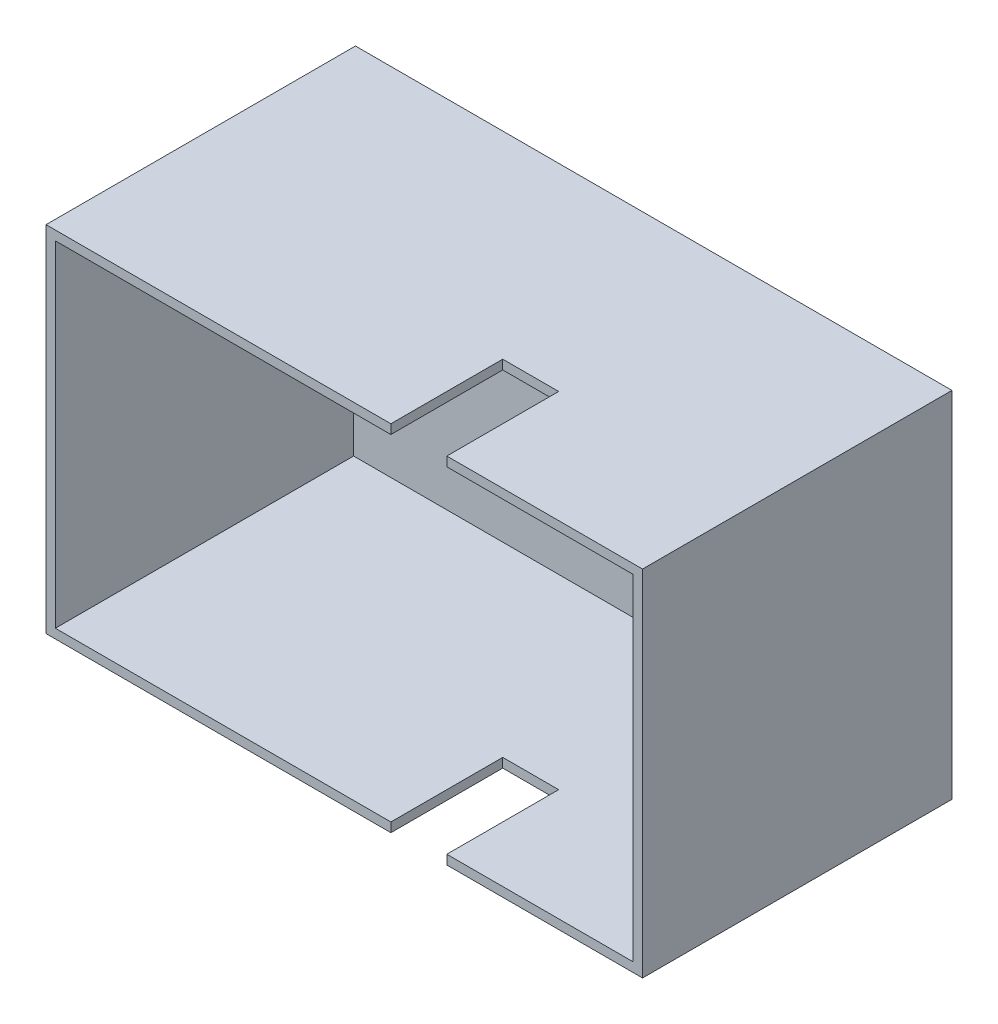
ISO-10303-21;
HEADER;
FILE_DESCRIPTION(('STEP AP214'),'2;1');
FILE_NAME('part.step','',(''),(''),'','','');
FILE_SCHEMA(('AUTOMOTIVE_DESIGN { 1 0 10303 214 1 1 1 1 }'));
ENDSEC;
DATA;
#1=APPLICATION_CONTEXT('core data for automotive mechanical design processes');
#2=APPLICATION_PROTOCOL_DEFINITION('international standard','automotive_design',2000,#1);
#3=PRODUCT_CONTEXT('',#1,'mechanical');
#4=PRODUCT('Part','Part','',(#3));
#5=PRODUCT_RELATED_PRODUCT_CATEGORY('part','',(#4));
#6=PRODUCT_DEFINITION_FORMATION('','',#4);
#7=PRODUCT_DEFINITION_CONTEXT('part definition',#1,'design');
#8=PRODUCT_DEFINITION('design','',#6,#7);
#9=PRODUCT_DEFINITION_SHAPE('','',#8);
#10=(LENGTH_UNIT() NAMED_UNIT(*) SI_UNIT(.MILLI.,.METRE.));
#11=(NAMED_UNIT(*) PLANE_ANGLE_UNIT() SI_UNIT($,.RADIAN.));
#12=(NAMED_UNIT(*) SI_UNIT($,.STERADIAN.) SOLID_ANGLE_UNIT());
#13=UNCERTAINTY_MEASURE_WITH_UNIT(LENGTH_MEASURE(1.E-05),#10,'distance_accuracy_value','');
#14=(GEOMETRIC_REPRESENTATION_CONTEXT(3) GLOBAL_UNCERTAINTY_ASSIGNED_CONTEXT((#13)) GLOBAL_UNIT_ASSIGNED_CONTEXT((#10,
#11,#12)) REPRESENTATION_CONTEXT('',''));
#15=CARTESIAN_POINT('',(0.,0.,0.));
#16=DIRECTION('',(0.,0.,1.));
#17=DIRECTION('',(1.,0.,0.));
#18=AXIS2_PLACEMENT_3D('',#15,#16,#17);
#19=CARTESIAN_POINT('',(0.,0.,80.));
#20=DIRECTION('',(0.,0.,1.));
#21=DIRECTION('',(1.,0.,0.));
#22=AXIS2_PLACEMENT_3D('',#19,#20,#21);
#23=PLANE('',#22);
#24=DIRECTION('',(0.,-1.,0.));
#25=VECTOR('',#24,1.);
#26=CARTESIAN_POINT('',(27.5,47.5,80.));
#27=LINE('',#26,#25);
#28=CARTESIAN_POINT('',(27.5,-45.,80.));
#29=VERTEX_POINT('',#28);
#30=CARTESIAN_POINT('',(27.5,-47.5,80.));
#31=VERTEX_POINT('',#30);
#32=EDGE_CURVE('E287',#29,#31,#27,.T.);
#33=ORIENTED_EDGE('',*,*,#32,.T.);
#34=DIRECTION('',(1.,0.,0.));
#35=VECTOR('',#34,1.);
#36=CARTESIAN_POINT('',(-80.,-47.5,80.));
#37=LINE('',#36,#35);
#38=CARTESIAN_POINT('',(80.,-47.5,80.));
#39=VERTEX_POINT('',#38);
#40=EDGE_CURVE('E279',#31,#39,#37,.T.);
#41=ORIENTED_EDGE('',*,*,#40,.T.);
#42=DIRECTION('',(0.,1.,0.));
#43=VECTOR('',#42,1.);
#44=CARTESIAN_POINT('',(80.,47.5,80.));
#45=LINE('',#44,#43);
#46=CARTESIAN_POINT('',(80.,47.5,80.));
#47=VERTEX_POINT('',#46);
#48=EDGE_CURVE('E172',#39,#47,#45,.T.);
#49=ORIENTED_EDGE('',*,*,#48,.T.);
#50=DIRECTION('',(-1.,0.,0.));
#51=VECTOR('',#50,1.);
#52=CARTESIAN_POINT('',(-80.,47.5,80.));
#53=LINE('',#52,#51);
#54=CARTESIAN_POINT('',(27.5,47.5,80.));
#55=VERTEX_POINT('',#54);
#56=EDGE_CURVE('E171',#47,#55,#53,.T.);
#57=ORIENTED_EDGE('',*,*,#56,.T.);
#58=CARTESIAN_POINT('',(27.5,45.,80.));
#59=VERTEX_POINT('',#58);
#60=EDGE_CURVE('E224',#55,#59,#27,.T.);
#61=ORIENTED_EDGE('',*,*,#60,.T.);
#62=DIRECTION('',(-1.,0.,0.));
#63=VECTOR('',#62,1.);
#64=CARTESIAN_POINT('',(-77.5,45.,80.));
#65=LINE('',#64,#63);
#66=CARTESIAN_POINT('',(77.5,45.,80.));
#67=VERTEX_POINT('',#66);
#68=EDGE_CURVE('E251',#67,#59,#65,.T.);
#69=ORIENTED_EDGE('',*,*,#68,.F.);
#70=DIRECTION('',(0.,1.,0.));
#71=VECTOR('',#70,1.);
#72=CARTESIAN_POINT('',(77.5,45.,80.));
#73=LINE('',#72,#71);
#74=CARTESIAN_POINT('',(77.5,-45.,80.));
#75=VERTEX_POINT('',#74);
#76=EDGE_CURVE('E248',#75,#67,#73,.T.);
#77=ORIENTED_EDGE('',*,*,#76,.F.);
#78=DIRECTION('',(1.,0.,0.));
#79=VECTOR('',#78,1.);
#80=CARTESIAN_POINT('',(-77.5,-45.,80.));
#81=LINE('',#80,#79);
#82=EDGE_CURVE('E257',#29,#75,#81,.T.);
#83=ORIENTED_EDGE('',*,*,#82,.F.);
#84=EDGE_LOOP('',(#33,#41,#49,#57,#61,#69,#77,#83));
#85=FACE_BOUND('',#84,.T.);
#86=ADVANCED_FACE('F36',(#85),#23,.T.);
#87=DIRECTION('',(0.,-1.,0.));
#88=VECTOR('',#87,1.);
#89=CARTESIAN_POINT('',(12.5,47.5,80.));
#90=LINE('',#89,#88);
#91=CARTESIAN_POINT('',(12.5,47.5,80.));
#92=VERTEX_POINT('',#91);
#93=CARTESIAN_POINT('',(12.5,45.,80.));
#94=VERTEX_POINT('',#93);
#95=EDGE_CURVE('E51',#92,#94,#90,.T.);
#96=ORIENTED_EDGE('',*,*,#95,.F.);
#97=CARTESIAN_POINT('',(-80.,47.5,80.));
#98=VERTEX_POINT('',#97);
#99=EDGE_CURVE('E161',#92,#98,#53,.T.);
#100=ORIENTED_EDGE('',*,*,#99,.T.);
#101=DIRECTION('',(0.,-1.,0.));
#102=VECTOR('',#101,1.);
#103=CARTESIAN_POINT('',(-80.,47.5,80.));
#104=LINE('',#103,#102);
#105=CARTESIAN_POINT('',(-80.,-47.5,80.));
#106=VERTEX_POINT('',#105);
#107=EDGE_CURVE('E278',#98,#106,#104,.T.);
#108=ORIENTED_EDGE('',*,*,#107,.T.);
#109=CARTESIAN_POINT('',(12.5,-47.5,80.));
#110=VERTEX_POINT('',#109);
#111=EDGE_CURVE('E175',#106,#110,#37,.T.);
#112=ORIENTED_EDGE('',*,*,#111,.T.);
#113=CARTESIAN_POINT('',(12.5,-45.,80.));
#114=VERTEX_POINT('',#113);
#115=EDGE_CURVE('E165',#114,#110,#90,.T.);
#116=ORIENTED_EDGE('',*,*,#115,.F.);
#117=CARTESIAN_POINT('',(-77.5,-45.,80.));
#118=VERTEX_POINT('',#117);
#119=EDGE_CURVE('E210',#118,#114,#81,.T.);
#120=ORIENTED_EDGE('',*,*,#119,.F.);
#121=DIRECTION('',(0.,-1.,0.));
#122=VECTOR('',#121,1.);
#123=CARTESIAN_POINT('',(-77.5,45.,80.));
#124=LINE('',#123,#122);
#125=CARTESIAN_POINT('',(-77.5,45.,80.));
#126=VERTEX_POINT('',#125);
#127=EDGE_CURVE('E254',#126,#118,#124,.T.);
#128=ORIENTED_EDGE('',*,*,#127,.F.);
#129=EDGE_CURVE('E164',#94,#126,#65,.T.);
#130=ORIENTED_EDGE('',*,*,#129,.F.);
#131=EDGE_LOOP('',(#96,#100,#108,#112,#116,#120,#128,#130));
#132=FACE_BOUND('',#131,.T.);
#133=ADVANCED_FACE('F159',(#132),#23,.T.);
#134=CARTESIAN_POINT('',(-80.,47.5,80.));
#135=DIRECTION('',(1.,0.,0.));
#136=DIRECTION('',(0.,1.,0.));
#137=AXIS2_PLACEMENT_3D('',#134,#135,#136);
#138=PLANE('',#137);
#139=DIRECTION('',(0.,0.,-1.));
#140=VECTOR('',#139,1.);
#141=CARTESIAN_POINT('',(-80.,47.5,80.));
#142=LINE('',#141,#140);
#143=CARTESIAN_POINT('',(-80.,47.5,-3.));
#144=VERTEX_POINT('',#143);
#145=EDGE_CURVE('E169',#98,#144,#142,.T.);
#146=ORIENTED_EDGE('',*,*,#145,.T.);
#147=DIRECTION('',(0.,1.,0.));
#148=VECTOR('',#147,1.);
#149=CARTESIAN_POINT('',(-80.,47.5,-3.));
#150=LINE('',#149,#148);
#151=CARTESIAN_POINT('',(-80.,-47.5,-3.));
#152=VERTEX_POINT('',#151);
#153=EDGE_CURVE('E241',#152,#144,#150,.T.);
#154=ORIENTED_EDGE('',*,*,#153,.F.);
#155=DIRECTION('',(0.,0.,-1.));
#156=VECTOR('',#155,1.);
#157=CARTESIAN_POINT('',(-80.,-47.5,80.));
#158=LINE('',#157,#156);
#159=EDGE_CURVE('E184',#106,#152,#158,.T.);
#160=ORIENTED_EDGE('',*,*,#159,.F.);
#161=ORIENTED_EDGE('',*,*,#107,.F.);
#162=EDGE_LOOP('',(#146,#154,#160,#161));
#163=FACE_BOUND('',#162,.T.);
#164=ADVANCED_FACE('F38',(#163),#138,.F.);
#165=CARTESIAN_POINT('',(-80.,-47.5,80.));
#166=DIRECTION('',(0.,1.,0.));
#167=DIRECTION('',(0.,0.,1.));
#168=AXIS2_PLACEMENT_3D('',#165,#166,#167);
#169=PLANE('',#168);
#170=ORIENTED_EDGE('',*,*,#40,.F.);
#171=DIRECTION('',(0.,0.,1.));
#172=VECTOR('',#171,1.);
#173=CARTESIAN_POINT('',(27.5,-47.5,50.));
#174=LINE('',#173,#172);
#175=CARTESIAN_POINT('',(27.5,-47.5,50.));
#176=VERTEX_POINT('',#175);
#177=EDGE_CURVE('E155',#176,#31,#174,.T.);
#178=ORIENTED_EDGE('',*,*,#177,.F.);
#179=DIRECTION('',(1.,0.,0.));
#180=VECTOR('',#179,1.);
#181=CARTESIAN_POINT('',(12.5,-47.5,50.));
#182=LINE('',#181,#180);
#183=CARTESIAN_POINT('',(12.5,-47.5,50.));
#184=VERTEX_POINT('',#183);
#185=EDGE_CURVE('E321',#184,#176,#182,.T.);
#186=ORIENTED_EDGE('',*,*,#185,.F.);
#187=DIRECTION('',(0.,0.,-1.));
#188=VECTOR('',#187,1.);
#189=CARTESIAN_POINT('',(12.5,-47.5,80.));
#190=LINE('',#189,#188);
#191=EDGE_CURVE('E323',#110,#184,#190,.T.);
#192=ORIENTED_EDGE('',*,*,#191,.F.);
#193=ORIENTED_EDGE('',*,*,#111,.F.);
#194=ORIENTED_EDGE('',*,*,#159,.T.);
#195=DIRECTION('',(-1.,0.,0.));
#196=VECTOR('',#195,1.);
#197=CARTESIAN_POINT('',(-80.,-47.5,-3.));
#198=LINE('',#197,#196);
#199=CARTESIAN_POINT('',(80.,-47.5,-3.));
#200=VERTEX_POINT('',#199);
#201=EDGE_CURVE('E238',#200,#152,#198,.T.);
#202=ORIENTED_EDGE('',*,*,#201,.F.);
#203=DIRECTION('',(0.,0.,-1.));
#204=VECTOR('',#203,1.);
#205=CARTESIAN_POINT('',(80.,-47.5,80.));
#206=LINE('',#205,#204);
#207=EDGE_CURVE('E182',#39,#200,#206,.T.);
#208=ORIENTED_EDGE('',*,*,#207,.F.);
#209=EDGE_LOOP('',(#170,#178,#186,#192,#193,#194,#202,#208));
#210=FACE_BOUND('',#209,.T.);
#211=ADVANCED_FACE('F291',(#210),#169,.F.);
#212=CARTESIAN_POINT('',(80.,47.5,80.));
#213=DIRECTION('',(-1.,0.,0.));
#214=DIRECTION('',(0.,0.,1.));
#215=AXIS2_PLACEMENT_3D('',#212,#213,#214);
#216=PLANE('',#215);
#217=ORIENTED_EDGE('',*,*,#207,.T.);
#218=DIRECTION('',(0.,-1.,0.));
#219=VECTOR('',#218,1.);
#220=CARTESIAN_POINT('',(80.,-47.5,-3.));
#221=LINE('',#220,#219);
#222=CARTESIAN_POINT('',(80.,47.5,-3.));
#223=VERTEX_POINT('',#222);
#224=EDGE_CURVE('E197',#223,#200,#221,.T.);
#225=ORIENTED_EDGE('',*,*,#224,.F.);
#226=DIRECTION('',(0.,0.,-1.));
#227=VECTOR('',#226,1.);
#228=CARTESIAN_POINT('',(80.,47.5,80.));
#229=LINE('',#228,#227);
#230=EDGE_CURVE('E180',#47,#223,#229,.T.);
#231=ORIENTED_EDGE('',*,*,#230,.F.);
#232=ORIENTED_EDGE('',*,*,#48,.F.);
#233=EDGE_LOOP('',(#217,#225,#231,#232));
#234=FACE_BOUND('',#233,.T.);
#235=ADVANCED_FACE('F294',(#234),#216,.F.);
#236=CARTESIAN_POINT('',(-80.,47.5,80.));
#237=DIRECTION('',(0.,-1.,0.));
#238=DIRECTION('',(0.,0.,-1.));
#239=AXIS2_PLACEMENT_3D('',#236,#237,#238);
#240=PLANE('',#239);
#241=DIRECTION('',(1.,0.,0.));
#242=VECTOR('',#241,1.);
#243=CARTESIAN_POINT('',(12.5,47.5,50.));
#244=LINE('',#243,#242);
#245=CARTESIAN_POINT('',(12.5,47.5,50.));
#246=VERTEX_POINT('',#245);
#247=CARTESIAN_POINT('',(27.5,47.5,50.));
#248=VERTEX_POINT('',#247);
#249=EDGE_CURVE('E154',#246,#248,#244,.T.);
#250=ORIENTED_EDGE('',*,*,#249,.T.);
#251=DIRECTION('',(0.,0.,1.));
#252=VECTOR('',#251,1.);
#253=CARTESIAN_POINT('',(27.5,47.5,50.));
#254=LINE('',#253,#252);
#255=EDGE_CURVE('E215',#248,#55,#254,.T.);
#256=ORIENTED_EDGE('',*,*,#255,.T.);
#257=ORIENTED_EDGE('',*,*,#56,.F.);
#258=ORIENTED_EDGE('',*,*,#230,.T.);
#259=DIRECTION('',(1.,0.,0.));
#260=VECTOR('',#259,1.);
#261=CARTESIAN_POINT('',(80.,47.5,-3.));
#262=LINE('',#261,#260);
#263=EDGE_CURVE('E244',#144,#223,#262,.T.);
#264=ORIENTED_EDGE('',*,*,#263,.F.);
#265=ORIENTED_EDGE('',*,*,#145,.F.);
#266=ORIENTED_EDGE('',*,*,#99,.F.);
#267=DIRECTION('',(0.,0.,-1.));
#268=VECTOR('',#267,1.);
#269=CARTESIAN_POINT('',(12.5,47.5,80.));
#270=LINE('',#269,#268);
#271=EDGE_CURVE('E146',#92,#246,#270,.T.);
#272=ORIENTED_EDGE('',*,*,#271,.T.);
#273=EDGE_LOOP('',(#250,#256,#257,#258,#264,#265,#266,#272));
#274=FACE_BOUND('',#273,.T.);
#275=ADVANCED_FACE('F167',(#274),#240,.F.);
#276=CARTESIAN_POINT('',(77.5,45.,80.));
#277=DIRECTION('',(-1.,0.,0.));
#278=DIRECTION('',(0.,0.,1.));
#279=AXIS2_PLACEMENT_3D('',#276,#277,#278);
#280=PLANE('',#279);
#281=DIRECTION('',(0.,1.,0.));
#282=VECTOR('',#281,1.);
#283=CARTESIAN_POINT('',(77.5,45.,0.));
#284=LINE('',#283,#282);
#285=CARTESIAN_POINT('',(77.5,-45.,0.));
#286=VERTEX_POINT('',#285);
#287=CARTESIAN_POINT('',(77.5,45.,0.));
#288=VERTEX_POINT('',#287);
#289=EDGE_CURVE('E247',#286,#288,#284,.T.);
#290=ORIENTED_EDGE('',*,*,#289,.F.);
#291=DIRECTION('',(0.,0.,-1.));
#292=VECTOR('',#291,1.);
#293=CARTESIAN_POINT('',(77.5,-45.,80.));
#294=LINE('',#293,#292);
#295=EDGE_CURVE('E259',#75,#286,#294,.T.);
#296=ORIENTED_EDGE('',*,*,#295,.F.);
#297=ORIENTED_EDGE('',*,*,#76,.T.);
#298=DIRECTION('',(0.,0.,-1.));
#299=VECTOR('',#298,1.);
#300=CARTESIAN_POINT('',(77.5,45.,80.));
#301=LINE('',#300,#299);
#302=EDGE_CURVE('E275',#67,#288,#301,.T.);
#303=ORIENTED_EDGE('',*,*,#302,.T.);
#304=EDGE_LOOP('',(#290,#296,#297,#303));
#305=FACE_BOUND('',#304,.T.);
#306=ADVANCED_FACE('F309',(#305),#280,.T.);
#307=CARTESIAN_POINT('',(-77.5,45.,80.));
#308=DIRECTION('',(0.,-1.,0.));
#309=DIRECTION('',(0.,0.,-1.));
#310=AXIS2_PLACEMENT_3D('',#307,#308,#309);
#311=PLANE('',#310);
#312=DIRECTION('',(0.,0.,1.));
#313=VECTOR('',#312,1.);
#314=CARTESIAN_POINT('',(27.5,45.,80.));
#315=LINE('',#314,#313);
#316=CARTESIAN_POINT('',(27.5,45.,50.));
#317=VERTEX_POINT('',#316);
#318=EDGE_CURVE('E226',#317,#59,#315,.T.);
#319=ORIENTED_EDGE('',*,*,#318,.F.);
#320=DIRECTION('',(1.,0.,0.));
#321=VECTOR('',#320,1.);
#322=CARTESIAN_POINT('',(-77.5,45.,50.));
#323=LINE('',#322,#321);
#324=CARTESIAN_POINT('',(12.5,45.,50.));
#325=VERTEX_POINT('',#324);
#326=EDGE_CURVE('E223',#325,#317,#323,.T.);
#327=ORIENTED_EDGE('',*,*,#326,.F.);
#328=DIRECTION('',(0.,0.,-1.));
#329=VECTOR('',#328,1.);
#330=CARTESIAN_POINT('',(12.5,45.,80.));
#331=LINE('',#330,#329);
#332=EDGE_CURVE('E221',#94,#325,#331,.T.);
#333=ORIENTED_EDGE('',*,*,#332,.F.);
#334=ORIENTED_EDGE('',*,*,#129,.T.);
#335=DIRECTION('',(0.,0.,-1.));
#336=VECTOR('',#335,1.);
#337=CARTESIAN_POINT('',(-77.5,45.,80.));
#338=LINE('',#337,#336);
#339=CARTESIAN_POINT('',(-77.5,45.,0.));
#340=VERTEX_POINT('',#339);
#341=EDGE_CURVE('E273',#126,#340,#338,.T.);
#342=ORIENTED_EDGE('',*,*,#341,.T.);
#343=DIRECTION('',(-1.,0.,0.));
#344=VECTOR('',#343,1.);
#345=CARTESIAN_POINT('',(-77.5,45.,0.));
#346=LINE('',#345,#344);
#347=EDGE_CURVE('E262',#288,#340,#346,.T.);
#348=ORIENTED_EDGE('',*,*,#347,.F.);
#349=ORIENTED_EDGE('',*,*,#302,.F.);
#350=ORIENTED_EDGE('',*,*,#68,.T.);
#351=EDGE_LOOP('',(#319,#327,#333,#334,#342,#348,#349,#350));
#352=FACE_BOUND('',#351,.T.);
#353=ADVANCED_FACE('F305',(#352),#311,.T.);
#354=CARTESIAN_POINT('',(-77.5,45.,80.));
#355=DIRECTION('',(1.,0.,0.));
#356=DIRECTION('',(0.,1.,0.));
#357=AXIS2_PLACEMENT_3D('',#354,#355,#356);
#358=PLANE('',#357);
#359=DIRECTION('',(0.,-1.,0.));
#360=VECTOR('',#359,1.);
#361=CARTESIAN_POINT('',(-77.5,45.,0.));
#362=LINE('',#361,#360);
#363=CARTESIAN_POINT('',(-77.5,-45.,0.));
#364=VERTEX_POINT('',#363);
#365=EDGE_CURVE('E265',#340,#364,#362,.T.);
#366=ORIENTED_EDGE('',*,*,#365,.F.);
#367=ORIENTED_EDGE('',*,*,#341,.F.);
#368=ORIENTED_EDGE('',*,*,#127,.T.);
#369=DIRECTION('',(0.,0.,-1.));
#370=VECTOR('',#369,1.);
#371=CARTESIAN_POINT('',(-77.5,-45.,80.));
#372=LINE('',#371,#370);
#373=EDGE_CURVE('E271',#118,#364,#372,.T.);
#374=ORIENTED_EDGE('',*,*,#373,.T.);
#375=EDGE_LOOP('',(#366,#367,#368,#374));
#376=FACE_BOUND('',#375,.T.);
#377=ADVANCED_FACE('F375',(#376),#358,.T.);
#378=CARTESIAN_POINT('',(-77.5,-45.,80.));
#379=DIRECTION('',(0.,1.,0.));
#380=DIRECTION('',(0.,0.,1.));
#381=AXIS2_PLACEMENT_3D('',#378,#379,#380);
#382=PLANE('',#381);
#383=DIRECTION('',(0.,0.,-1.));
#384=VECTOR('',#383,1.);
#385=CARTESIAN_POINT('',(27.5,-45.,80.));
#386=LINE('',#385,#384);
#387=CARTESIAN_POINT('',(27.5,-45.,50.));
#388=VERTEX_POINT('',#387);
#389=EDGE_CURVE('E11',#29,#388,#386,.T.);
#390=ORIENTED_EDGE('',*,*,#389,.F.);
#391=ORIENTED_EDGE('',*,*,#82,.T.);
#392=ORIENTED_EDGE('',*,*,#295,.T.);
#393=DIRECTION('',(1.,0.,0.));
#394=VECTOR('',#393,1.);
#395=CARTESIAN_POINT('',(-77.5,-45.,0.));
#396=LINE('',#395,#394);
#397=EDGE_CURVE('E250',#364,#286,#396,.T.);
#398=ORIENTED_EDGE('',*,*,#397,.F.);
#399=ORIENTED_EDGE('',*,*,#373,.F.);
#400=ORIENTED_EDGE('',*,*,#119,.T.);
#401=DIRECTION('',(0.,0.,1.));
#402=VECTOR('',#401,1.);
#403=CARTESIAN_POINT('',(12.5,-45.,80.));
#404=LINE('',#403,#402);
#405=CARTESIAN_POINT('',(12.5,-45.,50.));
#406=VERTEX_POINT('',#405);
#407=EDGE_CURVE('E186',#406,#114,#404,.T.);
#408=ORIENTED_EDGE('',*,*,#407,.F.);
#409=DIRECTION('',(-1.,0.,0.));
#410=VECTOR('',#409,1.);
#411=CARTESIAN_POINT('',(-77.5,-45.,50.));
#412=LINE('',#411,#410);
#413=EDGE_CURVE('E44',#388,#406,#412,.T.);
#414=ORIENTED_EDGE('',*,*,#413,.F.);
#415=EDGE_LOOP('',(#390,#391,#392,#398,#399,#400,#408,#414));
#416=FACE_BOUND('',#415,.T.);
#417=ADVANCED_FACE('F208',(#416),#382,.T.);
#418=CARTESIAN_POINT('',(0.,0.,0.));
#419=DIRECTION('',(0.,0.,1.));
#420=DIRECTION('',(1.,0.,0.));
#421=AXIS2_PLACEMENT_3D('',#418,#419,#420);
#422=PLANE('',#421);
#423=CARTESIAN_POINT('',(56.,0.,0.));
#424=DIRECTION('',(0.,0.,1.));
#425=DIRECTION('',(1.,0.,0.));
#426=AXIS2_PLACEMENT_3D('',#423,#424,#425);
#427=CIRCLE('',#426,4.00000000000001);
#428=CARTESIAN_POINT('',(60.,0.,0.));
#429=VERTEX_POINT('',#428);
#430=EDGE_CURVE('E228',#429,#429,#427,.T.);
#431=ORIENTED_EDGE('',*,*,#430,.F.);
#432=EDGE_LOOP('',(#431));
#433=FACE_BOUND('',#432,.T.);
#434=CARTESIAN_POINT('',(-56.,0.,0.));
#435=DIRECTION('',(0.,0.,1.));
#436=DIRECTION('',(1.,0.,0.));
#437=AXIS2_PLACEMENT_3D('',#434,#435,#436);
#438=CIRCLE('',#437,4.00000000000001);
#439=CARTESIAN_POINT('',(-52.,0.,0.));
#440=VERTEX_POINT('',#439);
#441=EDGE_CURVE('E229',#440,#440,#438,.T.);
#442=ORIENTED_EDGE('',*,*,#441,.F.);
#443=EDGE_LOOP('',(#442));
#444=FACE_BOUND('',#443,.T.);
#445=CARTESIAN_POINT('',(0.,0.,0.));
#446=DIRECTION('',(0.,0.,1.));
#447=DIRECTION('',(1.,0.,0.));
#448=AXIS2_PLACEMENT_3D('',#445,#446,#447);
#449=CIRCLE('',#448,4.);
#450=CARTESIAN_POINT('',(4.,0.,0.));
#451=VERTEX_POINT('',#450);
#452=EDGE_CURVE('E191',#451,#451,#449,.T.);
#453=ORIENTED_EDGE('',*,*,#452,.F.);
#454=EDGE_LOOP('',(#453));
#455=FACE_BOUND('',#454,.T.);
#456=ORIENTED_EDGE('',*,*,#397,.T.);
#457=ORIENTED_EDGE('',*,*,#289,.T.);
#458=ORIENTED_EDGE('',*,*,#347,.T.);
#459=ORIENTED_EDGE('',*,*,#365,.T.);
#460=EDGE_LOOP('',(#456,#457,#458,#459));
#461=FACE_BOUND('',#460,.T.);
#462=ADVANCED_FACE('F312',(#433,#444,#455,#461),#422,.T.);
#463=CARTESIAN_POINT('',(0.,0.,-3.));
#464=DIRECTION('',(0.,0.,1.));
#465=DIRECTION('',(1.,0.,0.));
#466=AXIS2_PLACEMENT_3D('',#463,#464,#465);
#467=PLANE('',#466);
#468=CARTESIAN_POINT('',(56.,0.,-3.));
#469=DIRECTION('',(0.,0.,1.));
#470=DIRECTION('',(1.,0.,0.));
#471=AXIS2_PLACEMENT_3D('',#468,#469,#470);
#472=CIRCLE('',#471,4.00000000000001);
#473=CARTESIAN_POINT('',(60.,0.,-3.));
#474=VERTEX_POINT('',#473);
#475=EDGE_CURVE('E194',#474,#474,#472,.T.);
#476=ORIENTED_EDGE('',*,*,#475,.T.);
#477=EDGE_LOOP('',(#476));
#478=FACE_BOUND('',#477,.T.);
#479=CARTESIAN_POINT('',(-56.,0.,-3.));
#480=DIRECTION('',(0.,0.,1.));
#481=DIRECTION('',(1.,0.,0.));
#482=AXIS2_PLACEMENT_3D('',#479,#480,#481);
#483=CIRCLE('',#482,4.00000000000001);
#484=CARTESIAN_POINT('',(-52.,0.,-3.));
#485=VERTEX_POINT('',#484);
#486=EDGE_CURVE('E190',#485,#485,#483,.T.);
#487=ORIENTED_EDGE('',*,*,#486,.T.);
#488=EDGE_LOOP('',(#487));
#489=FACE_BOUND('',#488,.T.);
#490=CARTESIAN_POINT('',(0.,0.,-3.));
#491=DIRECTION('',(0.,0.,1.));
#492=DIRECTION('',(1.,0.,0.));
#493=AXIS2_PLACEMENT_3D('',#490,#491,#492);
#494=CIRCLE('',#493,4.);
#495=CARTESIAN_POINT('',(4.,0.,-3.));
#496=VERTEX_POINT('',#495);
#497=EDGE_CURVE('E187',#496,#496,#494,.T.);
#498=ORIENTED_EDGE('',*,*,#497,.T.);
#499=EDGE_LOOP('',(#498));
#500=FACE_BOUND('',#499,.T.);
#501=ORIENTED_EDGE('',*,*,#224,.T.);
#502=ORIENTED_EDGE('',*,*,#201,.T.);
#503=ORIENTED_EDGE('',*,*,#153,.T.);
#504=ORIENTED_EDGE('',*,*,#263,.T.);
#505=EDGE_LOOP('',(#501,#502,#503,#504));
#506=FACE_BOUND('',#505,.T.);
#507=ADVANCED_FACE('F356',(#478,#489,#500,#506),#467,.F.);
#508=CARTESIAN_POINT('',(0.,0.,-10.));
#509=DIRECTION('',(0.,0.,1.));
#510=DIRECTION('',(1.,0.,0.));
#511=AXIS2_PLACEMENT_3D('',#508,#509,#510);
#512=CYLINDRICAL_SURFACE('',#511,4.);
#513=ORIENTED_EDGE('',*,*,#452,.T.);
#514=EDGE_LOOP('',(#513));
#515=FACE_BOUND('',#514,.T.);
#516=ORIENTED_EDGE('',*,*,#497,.F.);
#517=EDGE_LOOP('',(#516));
#518=FACE_BOUND('',#517,.T.);
#519=ADVANCED_FACE('F358',(#515,#518),#512,.F.);
#520=CARTESIAN_POINT('',(-56.,0.,-10.));
#521=DIRECTION('',(0.,0.,1.));
#522=DIRECTION('',(1.,0.,0.));
#523=AXIS2_PLACEMENT_3D('',#520,#521,#522);
#524=CYLINDRICAL_SURFACE('',#523,4.00000000000001);
#525=ORIENTED_EDGE('',*,*,#441,.T.);
#526=EDGE_LOOP('',(#525));
#527=FACE_BOUND('',#526,.T.);
#528=ORIENTED_EDGE('',*,*,#486,.F.);
#529=EDGE_LOOP('',(#528));
#530=FACE_BOUND('',#529,.T.);
#531=ADVANCED_FACE('F365',(#527,#530),#524,.F.);
#532=CARTESIAN_POINT('',(56.,0.,-10.));
#533=DIRECTION('',(0.,0.,1.));
#534=DIRECTION('',(1.,0.,0.));
#535=AXIS2_PLACEMENT_3D('',#532,#533,#534);
#536=CYLINDRICAL_SURFACE('',#535,4.00000000000001);
#537=ORIENTED_EDGE('',*,*,#430,.T.);
#538=EDGE_LOOP('',(#537));
#539=FACE_BOUND('',#538,.T.);
#540=ORIENTED_EDGE('',*,*,#475,.F.);
#541=EDGE_LOOP('',(#540));
#542=FACE_BOUND('',#541,.T.);
#543=ADVANCED_FACE('F430',(#539,#542),#536,.F.);
#544=CARTESIAN_POINT('',(12.5,47.5,80.));
#545=DIRECTION('',(-1.,0.,0.));
#546=DIRECTION('',(0.,0.,1.));
#547=AXIS2_PLACEMENT_3D('',#544,#545,#546);
#548=PLANE('',#547);
#549=ORIENTED_EDGE('',*,*,#407,.T.);
#550=ORIENTED_EDGE('',*,*,#115,.T.);
#551=ORIENTED_EDGE('',*,*,#191,.T.);
#552=DIRECTION('',(0.,-1.,0.));
#553=VECTOR('',#552,1.);
#554=CARTESIAN_POINT('',(12.5,47.5,50.));
#555=LINE('',#554,#553);
#556=EDGE_CURVE('E59',#406,#184,#555,.T.);
#557=ORIENTED_EDGE('',*,*,#556,.F.);
#558=EDGE_LOOP('',(#549,#550,#551,#557));
#559=FACE_BOUND('',#558,.T.);
#560=ADVANCED_FACE('F212',(#559),#548,.F.);
#561=CARTESIAN_POINT('',(12.5,47.5,50.));
#562=DIRECTION('',(0.,0.,-1.));
#563=DIRECTION('',(-1.,0.,0.));
#564=AXIS2_PLACEMENT_3D('',#561,#562,#563);
#565=PLANE('',#564);
#566=ORIENTED_EDGE('',*,*,#413,.T.);
#567=ORIENTED_EDGE('',*,*,#556,.T.);
#568=ORIENTED_EDGE('',*,*,#185,.T.);
#569=DIRECTION('',(0.,-1.,0.));
#570=VECTOR('',#569,1.);
#571=CARTESIAN_POINT('',(27.5,47.5,50.));
#572=LINE('',#571,#570);
#573=EDGE_CURVE('E204',#388,#176,#572,.T.);
#574=ORIENTED_EDGE('',*,*,#573,.F.);
#575=EDGE_LOOP('',(#566,#567,#568,#574));
#576=FACE_BOUND('',#575,.T.);
#577=ADVANCED_FACE('F202',(#576),#565,.F.);
#578=CARTESIAN_POINT('',(27.5,47.5,50.));
#579=DIRECTION('',(1.,0.,0.));
#580=DIRECTION('',(0.,0.,-1.));
#581=AXIS2_PLACEMENT_3D('',#578,#579,#580);
#582=PLANE('',#581);
#583=ORIENTED_EDGE('',*,*,#389,.T.);
#584=ORIENTED_EDGE('',*,*,#573,.T.);
#585=ORIENTED_EDGE('',*,*,#177,.T.);
#586=ORIENTED_EDGE('',*,*,#32,.F.);
#587=EDGE_LOOP('',(#583,#584,#585,#586));
#588=FACE_BOUND('',#587,.T.);
#589=ADVANCED_FACE('F316',(#588),#582,.F.);
#590=ORIENTED_EDGE('',*,*,#318,.T.);
#591=ORIENTED_EDGE('',*,*,#60,.F.);
#592=ORIENTED_EDGE('',*,*,#255,.F.);
#593=EDGE_CURVE('E317',#248,#317,#572,.T.);
#594=ORIENTED_EDGE('',*,*,#593,.T.);
#595=EDGE_LOOP('',(#590,#591,#592,#594));
#596=FACE_BOUND('',#595,.T.);
#597=ADVANCED_FACE('F327',(#596),#582,.F.);
#598=ORIENTED_EDGE('',*,*,#326,.T.);
#599=ORIENTED_EDGE('',*,*,#593,.F.);
#600=ORIENTED_EDGE('',*,*,#249,.F.);
#601=EDGE_CURVE('E149',#246,#325,#555,.T.);
#602=ORIENTED_EDGE('',*,*,#601,.T.);
#603=EDGE_LOOP('',(#598,#599,#600,#602));
#604=FACE_BOUND('',#603,.T.);
#605=ADVANCED_FACE('F326',(#604),#565,.F.);
#606=ORIENTED_EDGE('',*,*,#332,.T.);
#607=ORIENTED_EDGE('',*,*,#601,.F.);
#608=ORIENTED_EDGE('',*,*,#271,.F.);
#609=ORIENTED_EDGE('',*,*,#95,.T.);
#610=EDGE_LOOP('',(#606,#607,#608,#609));
#611=FACE_BOUND('',#610,.T.);
#612=ADVANCED_FACE('F147',(#611),#548,.F.);
#613=CLOSED_SHELL('',(#86,#133,#164,#211,#235,#275,#306,#353,#377,#417,#462,#507,#519,#531,#543,
#560,#577,#589,#597,#605,#612));
#614=MANIFOLD_SOLID_BREP('B2',#613);
#615=ADVANCED_BREP_SHAPE_REPRESENTATION('',(#18,#614),#14);
#616=SHAPE_DEFINITION_REPRESENTATION(#9,#615);
ENDSEC;
END-ISO-10303-21;
